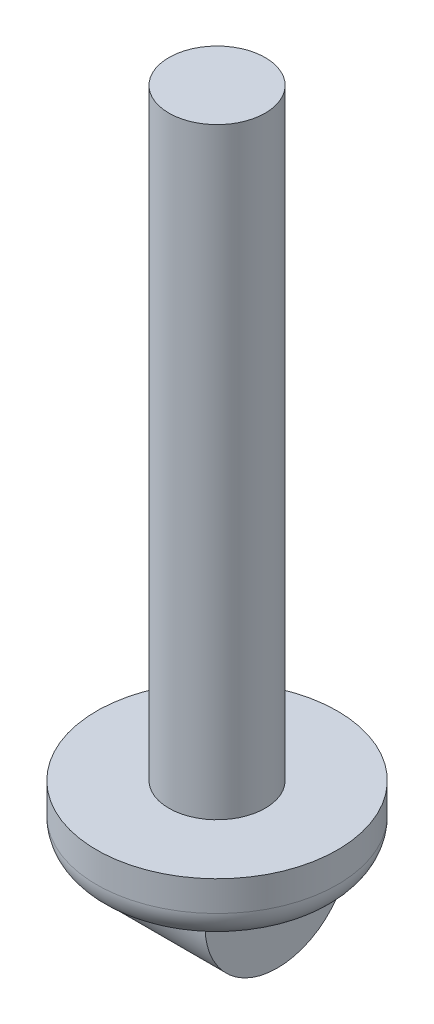
ISO-10303-21;
HEADER;
FILE_DESCRIPTION(('STEP AP214'),'2;1');
FILE_NAME('part.step','',(''),(''),'','','');
FILE_SCHEMA(('AUTOMOTIVE_DESIGN { 1 0 10303 214 1 1 1 1 }'));
ENDSEC;
DATA;
#1=APPLICATION_CONTEXT('core data for automotive mechanical design processes');
#2=APPLICATION_PROTOCOL_DEFINITION('international standard','automotive_design',2000,#1);
#3=PRODUCT_CONTEXT('',#1,'mechanical');
#4=PRODUCT('Part','Part','',(#3));
#5=PRODUCT_RELATED_PRODUCT_CATEGORY('part','',(#4));
#6=PRODUCT_DEFINITION_FORMATION('','',#4);
#7=PRODUCT_DEFINITION_CONTEXT('part definition',#1,'design');
#8=PRODUCT_DEFINITION('design','',#6,#7);
#9=PRODUCT_DEFINITION_SHAPE('','',#8);
#10=(LENGTH_UNIT() NAMED_UNIT(*) SI_UNIT(.MILLI.,.METRE.));
#11=(NAMED_UNIT(*) PLANE_ANGLE_UNIT() SI_UNIT($,.RADIAN.));
#12=(NAMED_UNIT(*) SI_UNIT($,.STERADIAN.) SOLID_ANGLE_UNIT());
#13=UNCERTAINTY_MEASURE_WITH_UNIT(LENGTH_MEASURE(1.E-05),#10,'distance_accuracy_value','');
#14=(GEOMETRIC_REPRESENTATION_CONTEXT(3) GLOBAL_UNCERTAINTY_ASSIGNED_CONTEXT((#13)) GLOBAL_UNIT_ASSIGNED_CONTEXT((#10,
#11,#12)) REPRESENTATION_CONTEXT('',''));
#15=CARTESIAN_POINT('',(0.,0.,0.));
#16=DIRECTION('',(0.,0.,1.));
#17=DIRECTION('',(1.,0.,0.));
#18=AXIS2_PLACEMENT_3D('',#15,#16,#17);
#19=CARTESIAN_POINT('',(0.,-5.,0.));
#20=DIRECTION('',(0.,-1.,0.));
#21=DIRECTION('',(0.,0.,-1.));
#22=AXIS2_PLACEMENT_3D('',#19,#20,#21);
#23=PLANE('',#22);
#24=CARTESIAN_POINT('',(0.,-5.,0.));
#25=DIRECTION('',(0.,-1.,0.));
#26=DIRECTION('',(0.,0.,-1.));
#27=AXIS2_PLACEMENT_3D('',#24,#25,#26);
#28=CIRCLE('',#27,7.5);
#29=CARTESIAN_POINT('',(4.5,-5.,6.));
#30=VERTEX_POINT('',#29);
#31=CARTESIAN_POINT('',(-4.5,-5.,6.));
#32=VERTEX_POINT('',#31);
#33=EDGE_CURVE('E169',#30,#32,#28,.T.);
#34=ORIENTED_EDGE('',*,*,#33,.T.);
#35=DIRECTION('',(-1.,0.,0.));
#36=VECTOR('',#35,1.);
#37=CARTESIAN_POINT('',(5.,-5.,6.));
#38=LINE('',#37,#36);
#39=EDGE_CURVE('E137',#30,#32,#38,.T.);
#40=ORIENTED_EDGE('',*,*,#39,.F.);
#41=EDGE_LOOP('',(#34,#40));
#42=FACE_BOUND('',#41,.T.);
#43=ADVANCED_FACE('F39',(#42),#23,.T.);
#44=CARTESIAN_POINT('',(-4.5,-5.,-6.));
#45=VERTEX_POINT('',#44);
#46=CARTESIAN_POINT('',(4.5,-5.,-6.));
#47=VERTEX_POINT('',#46);
#48=EDGE_CURVE('E170',#45,#47,#28,.T.);
#49=ORIENTED_EDGE('',*,*,#48,.T.);
#50=DIRECTION('',(-1.,0.,0.));
#51=VECTOR('',#50,1.);
#52=CARTESIAN_POINT('',(5.,-5.,-6.));
#53=LINE('',#52,#51);
#54=EDGE_CURVE('E54',#47,#45,#53,.T.);
#55=ORIENTED_EDGE('',*,*,#54,.T.);
#56=EDGE_LOOP('',(#49,#55));
#57=FACE_BOUND('',#56,.T.);
#58=ADVANCED_FACE('F183',(#57),#23,.T.);
#59=CARTESIAN_POINT('',(-5.00000000000001,-5.,5.59016994374946));
#60=VERTEX_POINT('',#59);
#61=CARTESIAN_POINT('',(-4.99999999999276,-5.,-5.59016994375595));
#62=VERTEX_POINT('',#61);
#63=EDGE_CURVE('E163',#60,#62,#28,.T.);
#64=ORIENTED_EDGE('',*,*,#63,.T.);
#65=DIRECTION('',(0.,0.,1.));
#66=VECTOR('',#65,1.);
#67=CARTESIAN_POINT('',(-5.,-5.,6.));
#68=LINE('',#67,#66);
#69=EDGE_CURVE('E155',#62,#60,#68,.T.);
#70=ORIENTED_EDGE('',*,*,#69,.T.);
#71=EDGE_LOOP('',(#64,#70));
#72=FACE_BOUND('',#71,.T.);
#73=ADVANCED_FACE('F162',(#72),#23,.T.);
#74=CARTESIAN_POINT('',(0.,50.,0.));
#75=DIRECTION('',(0.,-1.,0.));
#76=DIRECTION('',(0.,0.,-1.));
#77=AXIS2_PLACEMENT_3D('',#74,#75,#76);
#78=CYLINDRICAL_SURFACE('',#77,4.);
#79=CARTESIAN_POINT('',(0.,50.,0.));
#80=DIRECTION('',(0.,1.,0.));
#81=DIRECTION('',(0.,0.,1.));
#82=AXIS2_PLACEMENT_3D('',#79,#80,#81);
#83=CIRCLE('',#82,4.);
#84=CARTESIAN_POINT('',(0.,50.,4.));
#85=VERTEX_POINT('',#84);
#86=EDGE_CURVE('E177',#85,#85,#83,.T.);
#87=ORIENTED_EDGE('',*,*,#86,.F.);
#88=EDGE_LOOP('',(#87));
#89=FACE_BOUND('',#88,.T.);
#90=CARTESIAN_POINT('',(0.,0.,0.));
#91=DIRECTION('',(0.,1.,0.));
#92=DIRECTION('',(0.,0.,1.));
#93=AXIS2_PLACEMENT_3D('',#90,#91,#92);
#94=CIRCLE('',#93,4.);
#95=CARTESIAN_POINT('',(0.,0.,4.));
#96=VERTEX_POINT('',#95);
#97=EDGE_CURVE('E128',#96,#96,#94,.T.);
#98=ORIENTED_EDGE('',*,*,#97,.T.);
#99=EDGE_LOOP('',(#98));
#100=FACE_BOUND('',#99,.T.);
#101=ADVANCED_FACE('F210',(#89,#100),#78,.T.);
#102=CARTESIAN_POINT('',(0.,50.,0.));
#103=DIRECTION('',(0.,1.,0.));
#104=DIRECTION('',(0.,0.,1.));
#105=AXIS2_PLACEMENT_3D('',#102,#103,#104);
#106=PLANE('',#105);
#107=ORIENTED_EDGE('',*,*,#86,.T.);
#108=EDGE_LOOP('',(#107));
#109=FACE_BOUND('',#108,.T.);
#110=ADVANCED_FACE('F203',(#109),#106,.T.);
#111=CARTESIAN_POINT('',(0.,-5.,0.));
#112=DIRECTION('',(0.,1.,0.));
#113=DIRECTION('',(0.,0.,1.));
#114=AXIS2_PLACEMENT_3D('',#111,#112,#113);
#115=CYLINDRICAL_SURFACE('',#114,10.);
#116=CARTESIAN_POINT('',(0.,-2.5,0.));
#117=DIRECTION('',(0.,-1.,0.));
#118=DIRECTION('',(0.,0.,-1.));
#119=AXIS2_PLACEMENT_3D('',#116,#117,#118);
#120=CIRCLE('',#119,10.);
#121=CARTESIAN_POINT('',(0.,-2.5,-10.));
#122=VERTEX_POINT('',#121);
#123=EDGE_CURVE('E11',#122,#122,#120,.F.);
#124=ORIENTED_EDGE('',*,*,#123,.T.);
#125=EDGE_LOOP('',(#124));
#126=FACE_BOUND('',#125,.T.);
#127=CARTESIAN_POINT('',(0.,0.,0.));
#128=DIRECTION('',(0.,-1.,0.));
#129=DIRECTION('',(0.,0.,-1.));
#130=AXIS2_PLACEMENT_3D('',#127,#128,#129);
#131=CIRCLE('',#130,10.);
#132=CARTESIAN_POINT('',(0.,0.,-10.));
#133=VERTEX_POINT('',#132);
#134=EDGE_CURVE('E122',#133,#133,#131,.T.);
#135=ORIENTED_EDGE('',*,*,#134,.T.);
#136=EDGE_LOOP('',(#135));
#137=FACE_BOUND('',#136,.T.);
#138=ADVANCED_FACE('F195',(#126,#137),#115,.T.);
#139=DIRECTION('',(0.,0.,1.));
#140=VECTOR('',#139,1.);
#141=CARTESIAN_POINT('',(5.,-5.,6.));
#142=LINE('',#141,#140);
#143=CARTESIAN_POINT('',(5.,-5.,-5.59016994376405));
#144=VERTEX_POINT('',#143);
#145=CARTESIAN_POINT('',(5.00000000000001,-5.,5.59016994374946));
#146=VERTEX_POINT('',#145);
#147=EDGE_CURVE('E105',#144,#146,#142,.T.);
#148=ORIENTED_EDGE('',*,*,#147,.F.);
#149=EDGE_CURVE('E173',#144,#146,#28,.T.);
#150=ORIENTED_EDGE('',*,*,#149,.T.);
#151=EDGE_LOOP('',(#148,#150));
#152=FACE_BOUND('',#151,.T.);
#153=ADVANCED_FACE('F190',(#152),#23,.T.);
#154=CARTESIAN_POINT('',(0.,0.,0.));
#155=DIRECTION('',(0.,-1.,0.));
#156=DIRECTION('',(0.,0.,-1.));
#157=AXIS2_PLACEMENT_3D('',#154,#155,#156);
#158=PLANE('',#157);
#159=ORIENTED_EDGE('',*,*,#97,.F.);
#160=EDGE_LOOP('',(#159));
#161=FACE_BOUND('',#160,.T.);
#162=ORIENTED_EDGE('',*,*,#134,.F.);
#163=EDGE_LOOP('',(#162));
#164=FACE_BOUND('',#163,.T.);
#165=ADVANCED_FACE('F194',(#161,#164),#158,.F.);
#166=CARTESIAN_POINT('',(0.,-2.5,0.));
#167=DIRECTION('',(0.,-1.,0.));
#168=DIRECTION('',(0.,0.,-1.));
#169=AXIS2_PLACEMENT_3D('',#166,#167,#168);
#170=TOROIDAL_SURFACE('',#169,7.5,2.5);
#171=ORIENTED_EDGE('',*,*,#123,.F.);
#172=EDGE_LOOP('',(#171));
#173=FACE_BOUND('',#172,.T.);
#174=EDGE_CURVE('E48',#47,#144,#28,.T.);
#175=ORIENTED_EDGE('',*,*,#174,.F.);
#176=ORIENTED_EDGE('',*,*,#48,.F.);
#177=EDGE_CURVE('E61',#62,#45,#28,.T.);
#178=ORIENTED_EDGE('',*,*,#177,.F.);
#179=ORIENTED_EDGE('',*,*,#63,.F.);
#180=EDGE_CURVE('E151',#32,#60,#28,.T.);
#181=ORIENTED_EDGE('',*,*,#180,.F.);
#182=ORIENTED_EDGE('',*,*,#33,.F.);
#183=EDGE_CURVE('E187',#146,#30,#28,.T.);
#184=ORIENTED_EDGE('',*,*,#183,.F.);
#185=ORIENTED_EDGE('',*,*,#149,.F.);
#186=EDGE_LOOP('',(#175,#176,#178,#179,#181,#182,#184,#185));
#187=FACE_BOUND('',#186,.T.);
#188=ADVANCED_FACE('F41',(#173,#187),#170,.T.);
#189=CARTESIAN_POINT('',(5.,-5.,6.));
#190=DIRECTION('',(0.,-1.,0.));
#191=DIRECTION('',(0.,0.,-1.));
#192=AXIS2_PLACEMENT_3D('',#189,#190,#191);
#193=PLANE('',#192);
#194=ORIENTED_EDGE('',*,*,#177,.T.);
#195=CARTESIAN_POINT('',(-5.,-5.,-6.));
#196=VERTEX_POINT('',#195);
#197=EDGE_CURVE('E124',#45,#196,#53,.T.);
#198=ORIENTED_EDGE('',*,*,#197,.T.);
#199=EDGE_CURVE('E116',#196,#62,#68,.T.);
#200=ORIENTED_EDGE('',*,*,#199,.T.);
#201=EDGE_LOOP('',(#194,#198,#200));
#202=FACE_BOUND('',#201,.T.);
#203=ADVANCED_FACE('F259',(#202),#193,.F.);
#204=ORIENTED_EDGE('',*,*,#180,.T.);
#205=CARTESIAN_POINT('',(-5.,-5.,6.));
#206=VERTEX_POINT('',#205);
#207=EDGE_CURVE('E149',#60,#206,#68,.T.);
#208=ORIENTED_EDGE('',*,*,#207,.T.);
#209=EDGE_CURVE('E104',#32,#206,#38,.T.);
#210=ORIENTED_EDGE('',*,*,#209,.F.);
#211=EDGE_LOOP('',(#204,#208,#210));
#212=FACE_BOUND('',#211,.T.);
#213=ADVANCED_FACE('F150',(#212),#193,.F.);
#214=ORIENTED_EDGE('',*,*,#183,.T.);
#215=CARTESIAN_POINT('',(5.,-5.,6.));
#216=VERTEX_POINT('',#215);
#217=EDGE_CURVE('E132',#216,#30,#38,.T.);
#218=ORIENTED_EDGE('',*,*,#217,.F.);
#219=EDGE_CURVE('E107',#146,#216,#142,.T.);
#220=ORIENTED_EDGE('',*,*,#219,.F.);
#221=EDGE_LOOP('',(#214,#218,#220));
#222=FACE_BOUND('',#221,.T.);
#223=ADVANCED_FACE('F270',(#222),#193,.F.);
#224=CARTESIAN_POINT('',(5.,-5.,0.));
#225=DIRECTION('',(-1.,0.,0.));
#226=DIRECTION('',(0.,0.,1.));
#227=AXIS2_PLACEMENT_3D('',#224,#225,#226);
#228=CYLINDRICAL_SURFACE('',#227,6.);
#229=CARTESIAN_POINT('',(-5.,-5.,0.));
#230=DIRECTION('',(1.,0.,0.));
#231=DIRECTION('',(0.,0.,-1.));
#232=AXIS2_PLACEMENT_3D('',#229,#230,#231);
#233=CIRCLE('',#232,6.);
#234=EDGE_CURVE('E145',#206,#196,#233,.T.);
#235=ORIENTED_EDGE('',*,*,#234,.T.);
#236=ORIENTED_EDGE('',*,*,#197,.F.);
#237=ORIENTED_EDGE('',*,*,#54,.F.);
#238=CARTESIAN_POINT('',(5.,-5.,-6.));
#239=VERTEX_POINT('',#238);
#240=EDGE_CURVE('E99',#239,#47,#53,.T.);
#241=ORIENTED_EDGE('',*,*,#240,.F.);
#242=CARTESIAN_POINT('',(5.,-5.,0.));
#243=DIRECTION('',(1.,0.,0.));
#244=DIRECTION('',(0.,0.,-1.));
#245=AXIS2_PLACEMENT_3D('',#242,#243,#244);
#246=CIRCLE('',#245,6.);
#247=EDGE_CURVE('E109',#216,#239,#246,.T.);
#248=ORIENTED_EDGE('',*,*,#247,.F.);
#249=ORIENTED_EDGE('',*,*,#217,.T.);
#250=ORIENTED_EDGE('',*,*,#39,.T.);
#251=ORIENTED_EDGE('',*,*,#209,.T.);
#252=EDGE_LOOP('',(#235,#236,#237,#241,#248,#249,#250,#251));
#253=FACE_BOUND('',#252,.T.);
#254=ADVANCED_FACE('F119',(#253),#228,.T.);
#255=ORIENTED_EDGE('',*,*,#174,.T.);
#256=EDGE_CURVE('E95',#239,#144,#142,.T.);
#257=ORIENTED_EDGE('',*,*,#256,.F.);
#258=ORIENTED_EDGE('',*,*,#240,.T.);
#259=EDGE_LOOP('',(#255,#257,#258));
#260=FACE_BOUND('',#259,.T.);
#261=ADVANCED_FACE('F97',(#260),#193,.F.);
#262=CARTESIAN_POINT('',(5.,-5.,0.));
#263=DIRECTION('',(1.,0.,0.));
#264=DIRECTION('',(0.,0.,-1.));
#265=AXIS2_PLACEMENT_3D('',#262,#263,#264);
#266=PLANE('',#265);
#267=ORIENTED_EDGE('',*,*,#247,.T.);
#268=ORIENTED_EDGE('',*,*,#256,.T.);
#269=ORIENTED_EDGE('',*,*,#147,.T.);
#270=ORIENTED_EDGE('',*,*,#219,.T.);
#271=EDGE_LOOP('',(#267,#268,#269,#270));
#272=FACE_BOUND('',#271,.T.);
#273=ADVANCED_FACE('F110',(#272),#266,.T.);
#274=CARTESIAN_POINT('',(-5.,-5.,0.));
#275=DIRECTION('',(1.,0.,0.));
#276=DIRECTION('',(0.,0.,-1.));
#277=AXIS2_PLACEMENT_3D('',#274,#275,#276);
#278=PLANE('',#277);
#279=ORIENTED_EDGE('',*,*,#234,.F.);
#280=ORIENTED_EDGE('',*,*,#207,.F.);
#281=ORIENTED_EDGE('',*,*,#69,.F.);
#282=ORIENTED_EDGE('',*,*,#199,.F.);
#283=EDGE_LOOP('',(#279,#280,#281,#282));
#284=FACE_BOUND('',#283,.T.);
#285=ADVANCED_FACE('F156',(#284),#278,.F.);
#286=CLOSED_SHELL('',(#43,#58,#73,#101,#110,#138,#153,#165,#188,#203,#213,#223,#254,#261,#273,#285));
#287=MANIFOLD_SOLID_BREP('B2',#286);
#288=ADVANCED_BREP_SHAPE_REPRESENTATION('',(#18,#287),#14);
#289=SHAPE_DEFINITION_REPRESENTATION(#9,#288);
ENDSEC;
END-ISO-10303-21;
